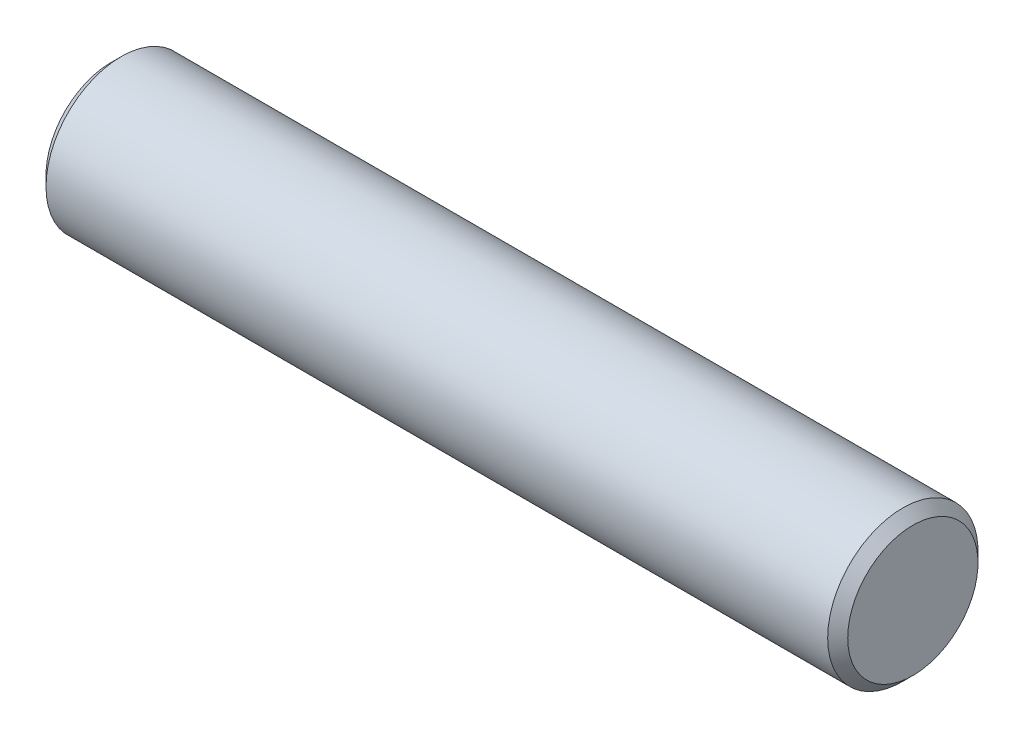
ISO-10303-21;
HEADER;
FILE_DESCRIPTION(('STEP AP214'),'2;1');
FILE_NAME('part.step','',(''),(''),'','','');
FILE_SCHEMA(('AUTOMOTIVE_DESIGN { 1 0 10303 214 1 1 1 1 }'));
ENDSEC;
DATA;
#1=APPLICATION_CONTEXT('core data for automotive mechanical design processes');
#2=APPLICATION_PROTOCOL_DEFINITION('international standard','automotive_design',2000,#1);
#3=PRODUCT_CONTEXT('',#1,'mechanical');
#4=PRODUCT('Part','Part','',(#3));
#5=PRODUCT_RELATED_PRODUCT_CATEGORY('part','',(#4));
#6=PRODUCT_DEFINITION_FORMATION('','',#4);
#7=PRODUCT_DEFINITION_CONTEXT('part definition',#1,'design');
#8=PRODUCT_DEFINITION('design','',#6,#7);
#9=PRODUCT_DEFINITION_SHAPE('','',#8);
#10=(LENGTH_UNIT() NAMED_UNIT(*) SI_UNIT(.MILLI.,.METRE.));
#11=(NAMED_UNIT(*) PLANE_ANGLE_UNIT() SI_UNIT($,.RADIAN.));
#12=(NAMED_UNIT(*) SI_UNIT($,.STERADIAN.) SOLID_ANGLE_UNIT());
#13=UNCERTAINTY_MEASURE_WITH_UNIT(LENGTH_MEASURE(1.E-05),#10,'distance_accuracy_value','');
#14=(GEOMETRIC_REPRESENTATION_CONTEXT(3) GLOBAL_UNCERTAINTY_ASSIGNED_CONTEXT((#13)) GLOBAL_UNIT_ASSIGNED_CONTEXT((#10,
#11,#12)) REPRESENTATION_CONTEXT('',''));
#15=CARTESIAN_POINT('',(0.,0.,0.));
#16=DIRECTION('',(0.,0.,1.));
#17=DIRECTION('',(1.,0.,0.));
#18=AXIS2_PLACEMENT_3D('',#15,#16,#17);
#19=CARTESIAN_POINT('',(-5.34269662921348,0.,0.));
#20=DIRECTION('',(1.,0.,0.));
#21=DIRECTION('',(0.,0.,-1.));
#22=AXIS2_PLACEMENT_3D('',#19,#20,#21);
#23=PLANE('',#22);
#24=CARTESIAN_POINT('',(-5.34269662921348,0.,0.));
#25=DIRECTION('',(1.,0.,0.));
#26=DIRECTION('',(0.,0.,-1.));
#27=AXIS2_PLACEMENT_3D('',#24,#25,#26);
#28=CIRCLE('',#27,1.3);
#29=CARTESIAN_POINT('',(-5.34269662921348,0.,-1.3));
#30=VERTEX_POINT('',#29);
#31=EDGE_CURVE('E50',#30,#30,#28,.F.);
#32=ORIENTED_EDGE('',*,*,#31,.T.);
#33=EDGE_LOOP('',(#32));
#34=FACE_BOUND('',#33,.T.);
#35=ADVANCED_FACE('F35',(#34),#23,.F.);
#36=CARTESIAN_POINT('',(-6.32022471910112,0.,0.));
#37=DIRECTION('',(-1.,0.,0.));
#38=DIRECTION('',(0.,0.,1.));
#39=AXIS2_PLACEMENT_3D('',#36,#37,#38);
#40=CYLINDRICAL_SURFACE('',#39,1.5);
#41=CARTESIAN_POINT('',(-5.14269662921348,0.,0.));
#42=DIRECTION('',(1.,0.,0.));
#43=DIRECTION('',(0.,0.,-1.));
#44=AXIS2_PLACEMENT_3D('',#41,#42,#43);
#45=CIRCLE('',#44,1.5);
#46=CARTESIAN_POINT('',(-5.14269662921348,0.,-1.5));
#47=VERTEX_POINT('',#46);
#48=EDGE_CURVE('E42',#47,#47,#45,.T.);
#49=ORIENTED_EDGE('',*,*,#48,.T.);
#50=EDGE_LOOP('',(#49));
#51=FACE_BOUND('',#50,.T.);
#52=CARTESIAN_POINT('',(10.4573033707865,0.,0.));
#53=DIRECTION('',(-1.,0.,0.));
#54=DIRECTION('',(0.,0.,1.));
#55=AXIS2_PLACEMENT_3D('',#52,#53,#54);
#56=CIRCLE('',#55,1.5);
#57=CARTESIAN_POINT('',(10.4573033707865,0.,1.5));
#58=VERTEX_POINT('',#57);
#59=EDGE_CURVE('E46',#58,#58,#56,.T.);
#60=ORIENTED_EDGE('',*,*,#59,.T.);
#61=EDGE_LOOP('',(#60));
#62=FACE_BOUND('',#61,.T.);
#63=ADVANCED_FACE('F66',(#51,#62),#40,.T.);
#64=CARTESIAN_POINT('',(10.6573033707865,1.5,0.));
#65=DIRECTION('',(-1.,0.,0.));
#66=DIRECTION('',(0.,0.,1.));
#67=AXIS2_PLACEMENT_3D('',#64,#65,#66);
#68=PLANE('',#67);
#69=CARTESIAN_POINT('',(10.6573033707865,0.,0.));
#70=DIRECTION('',(-1.,0.,0.));
#71=DIRECTION('',(0.,0.,1.));
#72=AXIS2_PLACEMENT_3D('',#69,#70,#71);
#73=CIRCLE('',#72,1.3);
#74=CARTESIAN_POINT('',(10.6573033707865,0.,1.3));
#75=VERTEX_POINT('',#74);
#76=EDGE_CURVE('E10',#75,#75,#73,.F.);
#77=ORIENTED_EDGE('',*,*,#76,.T.);
#78=EDGE_LOOP('',(#77));
#79=FACE_BOUND('',#78,.T.);
#80=ADVANCED_FACE('F59',(#79),#68,.F.);
#81=CARTESIAN_POINT('',(-5.34269662921348,0.,0.));
#82=DIRECTION('',(1.,0.,0.));
#83=DIRECTION('',(0.,0.,-1.));
#84=AXIS2_PLACEMENT_3D('',#81,#82,#83);
#85=CONICAL_SURFACE('',#84,1.3,0.785398163397445);
#86=ORIENTED_EDGE('',*,*,#48,.F.);
#87=EDGE_LOOP('',(#86));
#88=FACE_BOUND('',#87,.T.);
#89=ORIENTED_EDGE('',*,*,#31,.F.);
#90=EDGE_LOOP('',(#89));
#91=FACE_BOUND('',#90,.T.);
#92=ADVANCED_FACE('F57',(#88,#91),#85,.T.);
#93=CARTESIAN_POINT('',(10.4573033707865,0.,0.));
#94=DIRECTION('',(-1.,0.,0.));
#95=DIRECTION('',(0.,0.,1.));
#96=AXIS2_PLACEMENT_3D('',#93,#94,#95);
#97=CONICAL_SURFACE('',#96,1.5,0.785398163397446);
#98=ORIENTED_EDGE('',*,*,#76,.F.);
#99=EDGE_LOOP('',(#98));
#100=FACE_BOUND('',#99,.T.);
#101=ORIENTED_EDGE('',*,*,#59,.F.);
#102=EDGE_LOOP('',(#101));
#103=FACE_BOUND('',#102,.T.);
#104=ADVANCED_FACE('F37',(#100,#103),#97,.T.);
#105=CLOSED_SHELL('',(#35,#63,#80,#92,#104));
#106=MANIFOLD_SOLID_BREP('B2',#105);
#107=ADVANCED_BREP_SHAPE_REPRESENTATION('',(#18,#106),#14);
#108=SHAPE_DEFINITION_REPRESENTATION(#9,#107);
ENDSEC;
END-ISO-10303-21;
